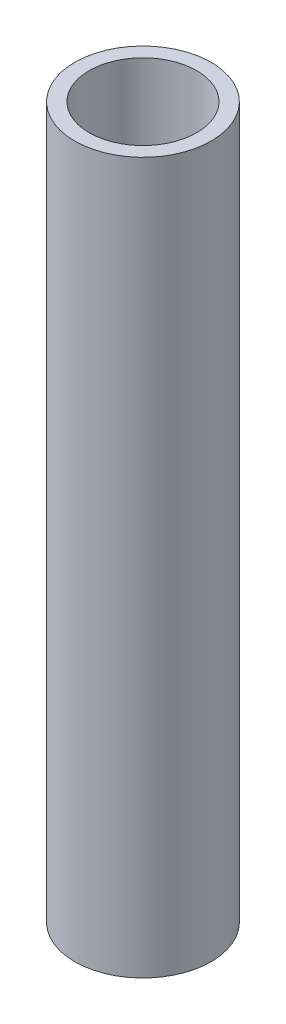
ISO-10303-21;
HEADER;
FILE_DESCRIPTION(('STEP AP214'),'2;1');
FILE_NAME('part.step','',(''),(''),'','','');
FILE_SCHEMA(('AUTOMOTIVE_DESIGN { 1 0 10303 214 1 1 1 1 }'));
ENDSEC;
DATA;
#1=APPLICATION_CONTEXT('core data for automotive mechanical design processes');
#2=APPLICATION_PROTOCOL_DEFINITION('international standard','automotive_design',2000,#1);
#3=PRODUCT_CONTEXT('',#1,'mechanical');
#4=PRODUCT('Part','Part','',(#3));
#5=PRODUCT_RELATED_PRODUCT_CATEGORY('part','',(#4));
#6=PRODUCT_DEFINITION_FORMATION('','',#4);
#7=PRODUCT_DEFINITION_CONTEXT('part definition',#1,'design');
#8=PRODUCT_DEFINITION('design','',#6,#7);
#9=PRODUCT_DEFINITION_SHAPE('','',#8);
#10=(LENGTH_UNIT() NAMED_UNIT(*) SI_UNIT(.MILLI.,.METRE.));
#11=(NAMED_UNIT(*) PLANE_ANGLE_UNIT() SI_UNIT($,.RADIAN.));
#12=(NAMED_UNIT(*) SI_UNIT($,.STERADIAN.) SOLID_ANGLE_UNIT());
#13=UNCERTAINTY_MEASURE_WITH_UNIT(LENGTH_MEASURE(1.E-05),#10,'distance_accuracy_value','');
#14=(GEOMETRIC_REPRESENTATION_CONTEXT(3) GLOBAL_UNCERTAINTY_ASSIGNED_CONTEXT((#13)) GLOBAL_UNIT_ASSIGNED_CONTEXT((#10,
#11,#12)) REPRESENTATION_CONTEXT('',''));
#15=CARTESIAN_POINT('',(0.,0.,0.));
#16=DIRECTION('',(0.,0.,1.));
#17=DIRECTION('',(1.,0.,0.));
#18=AXIS2_PLACEMENT_3D('',#15,#16,#17);
#19=CARTESIAN_POINT('',(0.,37.,0.));
#20=DIRECTION('',(0.,1.,0.));
#21=DIRECTION('',(0.,0.,1.));
#22=AXIS2_PLACEMENT_3D('',#19,#20,#21);
#23=PLANE('',#22);
#24=CARTESIAN_POINT('',(0.,37.,0.));
#25=DIRECTION('',(0.,1.,0.));
#26=DIRECTION('',(0.,0.,1.));
#27=AXIS2_PLACEMENT_3D('',#24,#25,#26);
#28=CIRCLE('',#27,3.55);
#29=CARTESIAN_POINT('',(0.,37.,3.55));
#30=VERTEX_POINT('',#29);
#31=EDGE_CURVE('E10',#30,#30,#28,.T.);
#32=ORIENTED_EDGE('',*,*,#31,.T.);
#33=EDGE_LOOP('',(#32));
#34=FACE_BOUND('',#33,.T.);
#35=CARTESIAN_POINT('',(0.,37.,0.));
#36=DIRECTION('',(0.,1.,0.));
#37=DIRECTION('',(0.,0.,1.));
#38=AXIS2_PLACEMENT_3D('',#35,#36,#37);
#39=CIRCLE('',#38,2.8);
#40=CARTESIAN_POINT('',(0.,37.,2.8));
#41=VERTEX_POINT('',#40);
#42=EDGE_CURVE('E48',#41,#41,#39,.T.);
#43=ORIENTED_EDGE('',*,*,#42,.F.);
#44=EDGE_LOOP('',(#43));
#45=FACE_BOUND('',#44,.T.);
#46=ADVANCED_FACE('F40',(#34,#45),#23,.T.);
#47=CARTESIAN_POINT('',(0.,0.,0.));
#48=DIRECTION('',(0.,1.,0.));
#49=DIRECTION('',(0.,0.,1.));
#50=AXIS2_PLACEMENT_3D('',#47,#48,#49);
#51=PLANE('',#50);
#52=CARTESIAN_POINT('',(0.,0.,0.));
#53=DIRECTION('',(0.,1.,0.));
#54=DIRECTION('',(0.,0.,1.));
#55=AXIS2_PLACEMENT_3D('',#52,#53,#54);
#56=CIRCLE('',#55,3.55);
#57=CARTESIAN_POINT('',(0.,0.,3.55));
#58=VERTEX_POINT('',#57);
#59=EDGE_CURVE('E41',#58,#58,#56,.T.);
#60=ORIENTED_EDGE('',*,*,#59,.F.);
#61=EDGE_LOOP('',(#60));
#62=FACE_BOUND('',#61,.T.);
#63=CARTESIAN_POINT('',(0.,0.,0.));
#64=DIRECTION('',(0.,1.,0.));
#65=DIRECTION('',(0.,0.,1.));
#66=AXIS2_PLACEMENT_3D('',#63,#64,#65);
#67=CIRCLE('',#66,2.8);
#68=CARTESIAN_POINT('',(0.,0.,2.8));
#69=VERTEX_POINT('',#68);
#70=EDGE_CURVE('E49',#69,#69,#67,.T.);
#71=ORIENTED_EDGE('',*,*,#70,.T.);
#72=EDGE_LOOP('',(#71));
#73=FACE_BOUND('',#72,.T.);
#74=ADVANCED_FACE('F58',(#62,#73),#51,.F.);
#75=CARTESIAN_POINT('',(0.,37.,0.));
#76=DIRECTION('',(0.,-1.,0.));
#77=DIRECTION('',(0.,0.,-1.));
#78=AXIS2_PLACEMENT_3D('',#75,#76,#77);
#79=CYLINDRICAL_SURFACE('',#78,3.55);
#80=ORIENTED_EDGE('',*,*,#31,.F.);
#81=EDGE_LOOP('',(#80));
#82=FACE_BOUND('',#81,.T.);
#83=ORIENTED_EDGE('',*,*,#59,.T.);
#84=EDGE_LOOP('',(#83));
#85=FACE_BOUND('',#84,.T.);
#86=ADVANCED_FACE('F39',(#82,#85),#79,.T.);
#87=CARTESIAN_POINT('',(0.,37.,0.));
#88=DIRECTION('',(0.,-1.,0.));
#89=DIRECTION('',(0.,0.,-1.));
#90=AXIS2_PLACEMENT_3D('',#87,#88,#89);
#91=CYLINDRICAL_SURFACE('',#90,2.8);
#92=ORIENTED_EDGE('',*,*,#42,.T.);
#93=EDGE_LOOP('',(#92));
#94=FACE_BOUND('',#93,.T.);
#95=ORIENTED_EDGE('',*,*,#70,.F.);
#96=EDGE_LOOP('',(#95));
#97=FACE_BOUND('',#96,.T.);
#98=ADVANCED_FACE('F57',(#94,#97),#91,.F.);
#99=CLOSED_SHELL('',(#46,#74,#86,#98));
#100=MANIFOLD_SOLID_BREP('B2',#99);
#101=ADVANCED_BREP_SHAPE_REPRESENTATION('',(#18,#100),#14);
#102=SHAPE_DEFINITION_REPRESENTATION(#9,#101);
ENDSEC;
END-ISO-10303-21;
